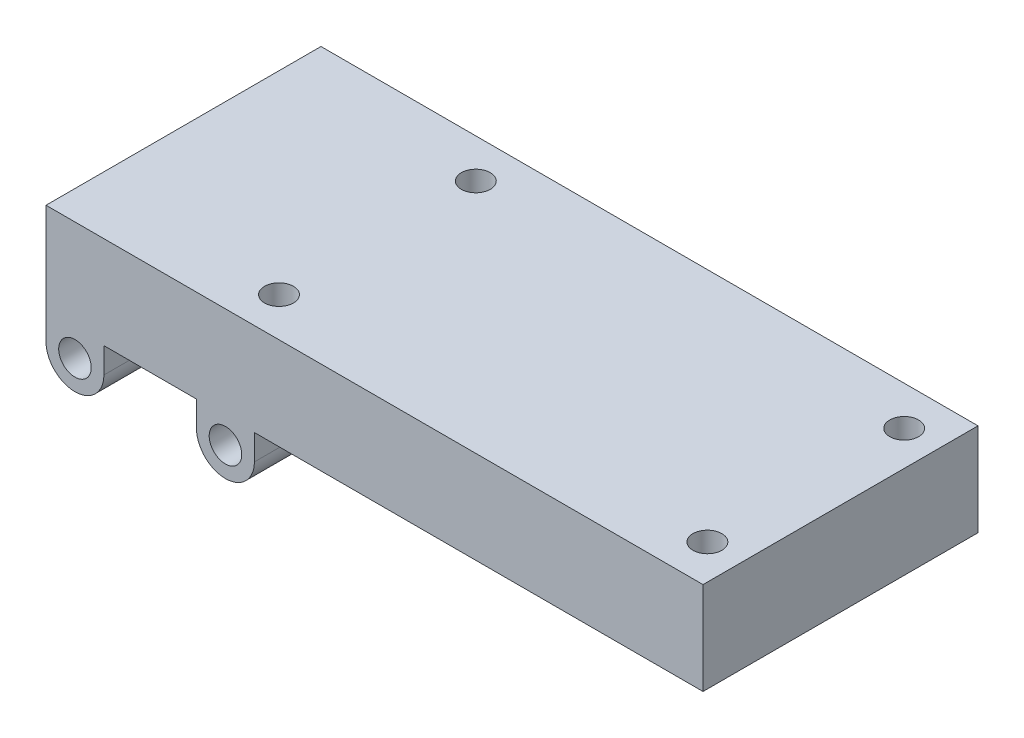
ISO-10303-21;
HEADER;
FILE_DESCRIPTION(('STEP AP214'),'2;1');
FILE_NAME('part.step','',(''),(''),'','','');
FILE_SCHEMA(('AUTOMOTIVE_DESIGN { 1 0 10303 214 1 1 1 1 }'));
ENDSEC;
DATA;
#1=APPLICATION_CONTEXT('core data for automotive mechanical design processes');
#2=APPLICATION_PROTOCOL_DEFINITION('international standard','automotive_design',2000,#1);
#3=PRODUCT_CONTEXT('',#1,'mechanical');
#4=PRODUCT('Part','Part','',(#3));
#5=PRODUCT_RELATED_PRODUCT_CATEGORY('part','',(#4));
#6=PRODUCT_DEFINITION_FORMATION('','',#4);
#7=PRODUCT_DEFINITION_CONTEXT('part definition',#1,'design');
#8=PRODUCT_DEFINITION('design','',#6,#7);
#9=PRODUCT_DEFINITION_SHAPE('','',#8);
#10=(LENGTH_UNIT() NAMED_UNIT(*) SI_UNIT(.MILLI.,.METRE.));
#11=(NAMED_UNIT(*) PLANE_ANGLE_UNIT() SI_UNIT($,.RADIAN.));
#12=(NAMED_UNIT(*) SI_UNIT($,.STERADIAN.) SOLID_ANGLE_UNIT());
#13=UNCERTAINTY_MEASURE_WITH_UNIT(LENGTH_MEASURE(1.E-05),#10,'distance_accuracy_value','');
#14=(GEOMETRIC_REPRESENTATION_CONTEXT(3) GLOBAL_UNCERTAINTY_ASSIGNED_CONTEXT((#13)) GLOBAL_UNIT_ASSIGNED_CONTEXT((#10,
#11,#12)) REPRESENTATION_CONTEXT('',''));
#15=CARTESIAN_POINT('',(0.,0.,0.));
#16=DIRECTION('',(0.,0.,1.));
#17=DIRECTION('',(1.,0.,0.));
#18=AXIS2_PLACEMENT_3D('',#15,#16,#17);
#19=CARTESIAN_POINT('',(0.,11.1125,0.));
#20=DIRECTION('',(0.,1.,0.));
#21=DIRECTION('',(-1.,0.,0.));
#22=AXIS2_PLACEMENT_3D('',#19,#20,#21);
#23=PLANE('',#22);
#24=CARTESIAN_POINT('',(-16.66875,11.1125,-9.52500000000001));
#25=DIRECTION('',(0.,1.,0.));
#26=DIRECTION('',(0.,0.,1.));
#27=AXIS2_PLACEMENT_3D('',#24,#25,#26);
#28=CIRCLE('',#27,1.5875);
#29=CARTESIAN_POINT('',(-16.66875,11.1125,-7.9375));
#30=VERTEX_POINT('',#29);
#31=EDGE_CURVE('E264',#30,#30,#28,.F.);
#32=ORIENTED_EDGE('',*,*,#31,.F.);
#33=EDGE_LOOP('',(#32));
#34=FACE_BOUND('',#33,.T.);
#35=CARTESIAN_POINT('',(-16.66875,11.1125,9.52499999999999));
#36=DIRECTION('',(0.,1.,0.));
#37=DIRECTION('',(0.,0.,1.));
#38=AXIS2_PLACEMENT_3D('',#35,#36,#37);
#39=CIRCLE('',#38,1.5875);
#40=CARTESIAN_POINT('',(-16.66875,11.1125,11.1125));
#41=VERTEX_POINT('',#40);
#42=EDGE_CURVE('E225',#41,#41,#39,.F.);
#43=ORIENTED_EDGE('',*,*,#42,.F.);
#44=EDGE_LOOP('',(#43));
#45=FACE_BOUND('',#44,.T.);
#46=CARTESIAN_POINT('',(16.66875,11.1125,-9.52500000000001));
#47=DIRECTION('',(0.,1.,0.));
#48=DIRECTION('',(0.,0.,1.));
#49=AXIS2_PLACEMENT_3D('',#46,#47,#48);
#50=CIRCLE('',#49,1.5875);
#51=CARTESIAN_POINT('',(16.66875,11.1125,-7.93750000000001));
#52=VERTEX_POINT('',#51);
#53=EDGE_CURVE('E261',#52,#52,#50,.F.);
#54=ORIENTED_EDGE('',*,*,#53,.F.);
#55=EDGE_LOOP('',(#54));
#56=FACE_BOUND('',#55,.T.);
#57=CARTESIAN_POINT('',(16.66875,11.1125,9.52499999999999));
#58=DIRECTION('',(0.,1.,0.));
#59=DIRECTION('',(0.,0.,1.));
#60=AXIS2_PLACEMENT_3D('',#57,#58,#59);
#61=CIRCLE('',#60,1.5875);
#62=CARTESIAN_POINT('',(16.66875,11.1125,11.1125));
#63=VERTEX_POINT('',#62);
#64=EDGE_CURVE('E258',#63,#63,#61,.F.);
#65=ORIENTED_EDGE('',*,*,#64,.F.);
#66=EDGE_LOOP('',(#65));
#67=FACE_BOUND('',#66,.T.);
#68=DIRECTION('',(1.,0.,0.));
#69=VECTOR('',#68,1.);
#70=CARTESIAN_POINT('',(-28.575,11.1125,-2.38125));
#71=LINE('',#70,#69);
#72=CARTESIAN_POINT('',(-28.575,11.1125,-2.38125));
#73=VERTEX_POINT('',#72);
#74=CARTESIAN_POINT('',(-22.225,11.1125,-2.38125));
#75=VERTEX_POINT('',#74);
#76=EDGE_CURVE('E139',#73,#75,#71,.T.);
#77=ORIENTED_EDGE('',*,*,#76,.F.);
#78=DIRECTION('',(0.,0.,1.));
#79=VECTOR('',#78,1.);
#80=CARTESIAN_POINT('',(-28.575,11.1125,-42.457115598187));
#81=LINE('',#80,#79);
#82=CARTESIAN_POINT('',(-28.575,11.1125,15.08125));
#83=VERTEX_POINT('',#82);
#84=EDGE_CURVE('E124',#73,#83,#81,.T.);
#85=ORIENTED_EDGE('',*,*,#84,.T.);
#86=DIRECTION('',(-1.,0.,0.));
#87=VECTOR('',#86,1.);
#88=CARTESIAN_POINT('',(0.,11.1125,15.08125));
#89=LINE('',#88,#87);
#90=CARTESIAN_POINT('',(-38.735,11.1125,15.08125));
#91=VERTEX_POINT('',#90);
#92=EDGE_CURVE('E234',#83,#91,#89,.T.);
#93=ORIENTED_EDGE('',*,*,#92,.T.);
#94=DIRECTION('',(0.,0.,1.));
#95=VECTOR('',#94,1.);
#96=CARTESIAN_POINT('',(-38.735,11.1125,-42.457115598187));
#97=LINE('',#96,#95);
#98=CARTESIAN_POINT('',(-38.735,11.1125,-2.38125));
#99=VERTEX_POINT('',#98);
#100=EDGE_CURVE('E57',#99,#91,#97,.T.);
#101=ORIENTED_EDGE('',*,*,#100,.F.);
#102=DIRECTION('',(1.,0.,0.));
#103=VECTOR('',#102,1.);
#104=CARTESIAN_POINT('',(-45.085,11.1125,-2.38125));
#105=LINE('',#104,#103);
#106=CARTESIAN_POINT('',(-45.085,11.1125,-2.38125));
#107=VERTEX_POINT('',#106);
#108=EDGE_CURVE('E62',#107,#99,#105,.T.);
#109=ORIENTED_EDGE('',*,*,#108,.F.);
#110=DIRECTION('',(0.,0.,1.));
#111=VECTOR('',#110,1.);
#112=CARTESIAN_POINT('',(-45.085,11.1125,-42.457115598187));
#113=LINE('',#112,#111);
#114=CARTESIAN_POINT('',(-45.085,11.1125,-15.08125));
#115=VERTEX_POINT('',#114);
#116=EDGE_CURVE('E11',#115,#107,#113,.T.);
#117=ORIENTED_EDGE('',*,*,#116,.F.);
#118=DIRECTION('',(1.,0.,0.));
#119=VECTOR('',#118,1.);
#120=CARTESIAN_POINT('',(0.,11.1125,-15.08125));
#121=LINE('',#120,#119);
#122=CARTESIAN_POINT('',(26.9875,11.1125,-15.08125));
#123=VERTEX_POINT('',#122);
#124=EDGE_CURVE('E220',#115,#123,#121,.T.);
#125=ORIENTED_EDGE('',*,*,#124,.T.);
#126=DIRECTION('',(0.,0.,1.));
#127=VECTOR('',#126,1.);
#128=CARTESIAN_POINT('',(26.9875,11.1125,0.));
#129=LINE('',#128,#127);
#130=CARTESIAN_POINT('',(26.9875,11.1125,15.08125));
#131=VERTEX_POINT('',#130);
#132=EDGE_CURVE('E171',#123,#131,#129,.T.);
#133=ORIENTED_EDGE('',*,*,#132,.T.);
#134=DIRECTION('',(1.,0.,0.));
#135=VECTOR('',#134,1.);
#136=CARTESIAN_POINT('',(12.3825,11.1125,15.08125));
#137=LINE('',#136,#135);
#138=CARTESIAN_POINT('',(-22.225,11.1125,15.08125));
#139=VERTEX_POINT('',#138);
#140=EDGE_CURVE('E50',#139,#131,#137,.T.);
#141=ORIENTED_EDGE('',*,*,#140,.F.);
#142=DIRECTION('',(0.,0.,1.));
#143=VECTOR('',#142,1.);
#144=CARTESIAN_POINT('',(-22.225,11.1125,-42.457115598187));
#145=LINE('',#144,#143);
#146=EDGE_CURVE('E145',#75,#139,#145,.T.);
#147=ORIENTED_EDGE('',*,*,#146,.F.);
#148=EDGE_LOOP('',(#77,#85,#93,#101,#109,#117,#125,#133,#141,#147));
#149=FACE_BOUND('',#148,.T.);
#150=ADVANCED_FACE('F42',(#34,#45,#56,#67,#149),#23,.F.);
#151=CARTESIAN_POINT('',(-41.91,8.3185,-42.457115598187));
#152=DIRECTION('',(0.,0.,1.));
#153=DIRECTION('',(1.,0.,0.));
#154=AXIS2_PLACEMENT_3D('',#151,#152,#153);
#155=CYLINDRICAL_SURFACE('',#154,1.78593749999999);
#156=CARTESIAN_POINT('',(-41.91,8.3185,15.08125));
#157=DIRECTION('',(0.,0.,1.));
#158=DIRECTION('',(1.,0.,0.));
#159=AXIS2_PLACEMENT_3D('',#156,#157,#158);
#160=CIRCLE('',#159,1.78593749999999);
#161=CARTESIAN_POINT('',(-40.1240625,8.3185,15.08125));
#162=VERTEX_POINT('',#161);
#163=EDGE_CURVE('E243',#162,#162,#160,.T.);
#164=CARTESIAN_POINT('',(-41.91,8.3185,0.793750000000003));
#165=DIRECTION('',(0.,0.,-1.));
#166=DIRECTION('',(-1.,0.,0.));
#167=AXIS2_PLACEMENT_3D('',#164,#165,#166);
#168=CIRCLE('',#167,1.78593749999999);
#169=CARTESIAN_POINT('',(-40.1240625,8.3185,0.793750000000003));
#170=VERTEX_POINT('',#169);
#171=EDGE_CURVE('E162',#170,#170,#168,.F.);
#172=CARTESIAN_POINT('',(-40.1240625,8.3185,15.08125));
#173=CARTESIAN_POINT('',(-40.1240625,8.3185,14.932421875));
#174=CARTESIAN_POINT('',(-40.1240625,8.3185,14.78359375));
#175=CARTESIAN_POINT('',(-40.1240625,8.3185,14.4859375));
#176=CARTESIAN_POINT('',(-40.1240625,8.3185,14.337109375));
#177=CARTESIAN_POINT('',(-40.1240625,8.3185,14.039453125));
#178=CARTESIAN_POINT('',(-40.1240625,8.3185,13.890625));
#179=CARTESIAN_POINT('',(-40.1240625,8.3185,13.59296875));
#180=CARTESIAN_POINT('',(-40.1240625,8.3185,13.444140625));
#181=CARTESIAN_POINT('',(-40.1240625,8.3185,13.146484375));
#182=CARTESIAN_POINT('',(-40.1240625,8.3185,12.99765625));
#183=CARTESIAN_POINT('',(-40.1240625,8.3185,12.7));
#184=CARTESIAN_POINT('',(-40.1240625,8.3185,12.551171875));
#185=CARTESIAN_POINT('',(-40.1240625,8.3185,12.253515625));
#186=CARTESIAN_POINT('',(-40.1240625,8.3185,12.1046875));
#187=CARTESIAN_POINT('',(-40.1240625,8.3185,11.80703125));
#188=CARTESIAN_POINT('',(-40.1240625,8.3185,11.658203125));
#189=CARTESIAN_POINT('',(-40.1240625,8.3185,11.360546875));
#190=CARTESIAN_POINT('',(-40.1240625,8.3185,11.21171875));
#191=CARTESIAN_POINT('',(-40.1240625,8.3185,10.9140625));
#192=CARTESIAN_POINT('',(-40.1240625,8.3185,10.765234375));
#193=CARTESIAN_POINT('',(-40.1240625,8.3185,10.467578125));
#194=CARTESIAN_POINT('',(-40.1240625,8.3185,10.31875));
#195=CARTESIAN_POINT('',(-40.1240625,8.3185,10.02109375));
#196=CARTESIAN_POINT('',(-40.1240625,8.3185,9.872265625));
#197=CARTESIAN_POINT('',(-40.1240625,8.3185,9.574609375));
#198=CARTESIAN_POINT('',(-40.1240625,8.3185,9.42578125));
#199=CARTESIAN_POINT('',(-40.1240625,8.3185,9.128125));
#200=CARTESIAN_POINT('',(-40.1240625,8.3185,8.979296875));
#201=CARTESIAN_POINT('',(-40.1240625,8.3185,8.681640625));
#202=CARTESIAN_POINT('',(-40.1240625,8.3185,8.5328125));
#203=CARTESIAN_POINT('',(-40.1240625,8.3185,8.23515625));
#204=CARTESIAN_POINT('',(-40.1240625,8.3185,8.086328125));
#205=CARTESIAN_POINT('',(-40.1240625,8.3185,7.788671875));
#206=CARTESIAN_POINT('',(-40.1240625,8.3185,7.63984375));
#207=CARTESIAN_POINT('',(-40.1240625,8.3185,7.3421875));
#208=CARTESIAN_POINT('',(-40.1240625,8.3185,7.193359375));
#209=CARTESIAN_POINT('',(-40.1240625,8.3185,6.895703125));
#210=CARTESIAN_POINT('',(-40.1240625,8.3185,6.746875));
#211=CARTESIAN_POINT('',(-40.1240625,8.3185,6.44921875));
#212=CARTESIAN_POINT('',(-40.1240625,8.3185,6.300390625));
#213=CARTESIAN_POINT('',(-40.1240625,8.3185,6.002734375));
#214=CARTESIAN_POINT('',(-40.1240625,8.3185,5.85390625));
#215=CARTESIAN_POINT('',(-40.1240625,8.3185,5.55625));
#216=CARTESIAN_POINT('',(-40.1240625,8.3185,5.407421875));
#217=CARTESIAN_POINT('',(-40.1240625,8.3185,5.109765625));
#218=CARTESIAN_POINT('',(-40.1240625,8.3185,4.96093750000001));
#219=CARTESIAN_POINT('',(-40.1240625,8.3185,4.66328125000001));
#220=CARTESIAN_POINT('',(-40.1240625,8.3185,4.514453125));
#221=CARTESIAN_POINT('',(-40.1240625,8.3185,4.216796875));
#222=CARTESIAN_POINT('',(-40.1240625,8.3185,4.06796875));
#223=CARTESIAN_POINT('',(-40.1240625,8.3185,3.7703125));
#224=CARTESIAN_POINT('',(-40.1240625,8.3185,3.621484375));
#225=CARTESIAN_POINT('',(-40.1240625,8.3185,3.323828125));
#226=CARTESIAN_POINT('',(-40.1240625,8.3185,3.175));
#227=CARTESIAN_POINT('',(-40.1240625,8.3185,2.87734375));
#228=CARTESIAN_POINT('',(-40.1240625,8.3185,2.728515625));
#229=CARTESIAN_POINT('',(-40.1240625,8.3185,2.430859375));
#230=CARTESIAN_POINT('',(-40.1240625,8.3185,2.28203125));
#231=CARTESIAN_POINT('',(-40.1240625,8.3185,1.984375));
#232=CARTESIAN_POINT('',(-40.1240625,8.3185,1.835546875));
#233=CARTESIAN_POINT('',(-40.1240625,8.3185,1.537890625));
#234=CARTESIAN_POINT('',(-40.1240625,8.3185,1.3890625));
#235=CARTESIAN_POINT('',(-40.1240625,8.3185,1.09140625));
#236=CARTESIAN_POINT('',(-40.1240625,8.3185,0.942578125000003));
#237=CARTESIAN_POINT('',(-40.1240625,8.3185,0.793750000000003));
#238=B_SPLINE_CURVE_WITH_KNOTS('',3,(#172,#173,#174,#175,#176,#177,#178,#179,#180,#181,#182,
#183,#184,#185,#186,#187,#188,#189,#190,#191,#192,#193,#194,#195,#196,#197,#198,#199,#200,#201,
#202,#203,#204,#205,#206,#207,#208,#209,#210,#211,#212,#213,#214,#215,#216,#217,#218,#219,#220,
#221,#222,#223,#224,#225,#226,#227,#228,#229,#230,#231,#232,#233,#234,#235,#236,#237),
.UNSPECIFIED.,.F.,.F.,(4,2,2,2,2,2,2,2,2,2,2,2,2,2,2,2,2,2,2,2,2,2,2,2,2,2,2,2,2,2,2,2,4),(0.,
0.446484375,0.892968750000001,1.339453125,1.7859375,2.232421875,2.67890625,3.125390625,3.571875,
4.018359375,4.46484375,4.911328125,5.3578125,5.804296875,6.25078125,6.697265625,7.14375,
7.590234375,8.03671875,8.483203125,8.9296875,9.376171875,9.82265624999999,10.269140625,
10.715625,11.162109375,11.60859375,12.055078125,12.5015625,12.948046875,13.39453125,
13.841015625,14.2875),.UNSPECIFIED.);
#239=EDGE_CURVE('BSEAM292',#162,#170,#238,.T.);
#240=ORIENTED_EDGE('',*,*,#163,.T.);
#241=ORIENTED_EDGE('',*,*,#171,.F.);
#242=ORIENTED_EDGE('',*,*,#239,.T.);
#243=ORIENTED_EDGE('',*,*,#239,.F.);
#244=EDGE_LOOP('',(#240,#242,#241,#243));
#245=FACE_BOUND('',#244,.T.);
#246=ADVANCED_FACE('F292',(#245),#155,.F.);
#247=CARTESIAN_POINT('',(-41.91,8.3185,-42.457115598187));
#248=DIRECTION('',(0.,0.,1.));
#249=DIRECTION('',(1.,0.,0.));
#250=AXIS2_PLACEMENT_3D('',#247,#248,#249);
#251=CYLINDRICAL_SURFACE('',#250,3.175);
#252=DIRECTION('',(0.,0.,1.));
#253=VECTOR('',#252,1.);
#254=CARTESIAN_POINT('',(-45.085,8.3185,-42.457115598187));
#255=LINE('',#254,#253);
#256=CARTESIAN_POINT('',(-45.085,8.3185,-2.38125));
#257=VERTEX_POINT('',#256);
#258=CARTESIAN_POINT('',(-45.085,8.3185,15.08125));
#259=VERTEX_POINT('',#258);
#260=EDGE_CURVE('E249',#257,#259,#255,.T.);
#261=ORIENTED_EDGE('',*,*,#260,.F.);
#262=CARTESIAN_POINT('',(-41.91,8.3185,-2.38125));
#263=DIRECTION('',(0.,0.,-1.));
#264=DIRECTION('',(-1.,0.,0.));
#265=AXIS2_PLACEMENT_3D('',#262,#263,#264);
#266=CIRCLE('',#265,3.175);
#267=CARTESIAN_POINT('',(-38.735,8.31850000000001,-2.38125));
#268=VERTEX_POINT('',#267);
#269=EDGE_CURVE('E155',#268,#257,#266,.T.);
#270=ORIENTED_EDGE('',*,*,#269,.F.);
#271=DIRECTION('',(0.,0.,1.));
#272=VECTOR('',#271,1.);
#273=CARTESIAN_POINT('',(-38.735,8.31850000000001,-42.457115598187));
#274=LINE('',#273,#272);
#275=CARTESIAN_POINT('',(-38.735,8.31850000000001,15.08125));
#276=VERTEX_POINT('',#275);
#277=EDGE_CURVE('E255',#268,#276,#274,.T.);
#278=ORIENTED_EDGE('',*,*,#277,.T.);
#279=CARTESIAN_POINT('',(-41.91,8.3185,15.08125));
#280=DIRECTION('',(0.,0.,1.));
#281=DIRECTION('',(1.,0.,0.));
#282=AXIS2_PLACEMENT_3D('',#279,#280,#281);
#283=CIRCLE('',#282,3.175);
#284=EDGE_CURVE('E228',#259,#276,#283,.T.);
#285=ORIENTED_EDGE('',*,*,#284,.F.);
#286=EDGE_LOOP('',(#261,#270,#278,#285));
#287=FACE_BOUND('',#286,.T.);
#288=ADVANCED_FACE('F298',(#287),#251,.T.);
#289=CARTESIAN_POINT('',(-38.735,0.,-42.457115598187));
#290=DIRECTION('',(-1.,0.,0.));
#291=DIRECTION('',(0.,0.,1.));
#292=AXIS2_PLACEMENT_3D('',#289,#290,#291);
#293=PLANE('',#292);
#294=ORIENTED_EDGE('',*,*,#277,.F.);
#295=DIRECTION('',(0.,-1.,0.));
#296=VECTOR('',#295,1.);
#297=CARTESIAN_POINT('',(-38.735,11.1125,-2.38125));
#298=LINE('',#297,#296);
#299=EDGE_CURVE('E152',#99,#268,#298,.T.);
#300=ORIENTED_EDGE('',*,*,#299,.F.);
#301=ORIENTED_EDGE('',*,*,#100,.T.);
#302=DIRECTION('',(0.,-1.,0.));
#303=VECTOR('',#302,1.);
#304=CARTESIAN_POINT('',(-38.735,0.,15.08125));
#305=LINE('',#304,#303);
#306=EDGE_CURVE('E231',#91,#276,#305,.T.);
#307=ORIENTED_EDGE('',*,*,#306,.T.);
#308=EDGE_LOOP('',(#294,#300,#301,#307));
#309=FACE_BOUND('',#308,.T.);
#310=ADVANCED_FACE('F398',(#309),#293,.F.);
#311=CARTESIAN_POINT('',(-28.575,0.,-42.457115598187));
#312=DIRECTION('',(-1.,0.,0.));
#313=DIRECTION('',(0.,-1.,0.));
#314=AXIS2_PLACEMENT_3D('',#311,#312,#313);
#315=PLANE('',#314);
#316=ORIENTED_EDGE('',*,*,#84,.F.);
#317=DIRECTION('',(0.,1.,0.));
#318=VECTOR('',#317,1.);
#319=CARTESIAN_POINT('',(-28.575,8.3185,-2.38125));
#320=LINE('',#319,#318);
#321=CARTESIAN_POINT('',(-28.575,8.3185,-2.38125));
#322=VERTEX_POINT('',#321);
#323=EDGE_CURVE('E127',#322,#73,#320,.T.);
#324=ORIENTED_EDGE('',*,*,#323,.F.);
#325=DIRECTION('',(0.,0.,1.));
#326=VECTOR('',#325,1.);
#327=CARTESIAN_POINT('',(-28.575,8.3185,-42.457115598187));
#328=LINE('',#327,#326);
#329=CARTESIAN_POINT('',(-28.575,8.3185,15.08125));
#330=VERTEX_POINT('',#329);
#331=EDGE_CURVE('E132',#322,#330,#328,.T.);
#332=ORIENTED_EDGE('',*,*,#331,.T.);
#333=DIRECTION('',(0.,-1.,0.));
#334=VECTOR('',#333,1.);
#335=CARTESIAN_POINT('',(-28.575,0.,15.08125));
#336=LINE('',#335,#334);
#337=EDGE_CURVE('E129',#83,#330,#336,.T.);
#338=ORIENTED_EDGE('',*,*,#337,.F.);
#339=EDGE_LOOP('',(#316,#324,#332,#338));
#340=FACE_BOUND('',#339,.T.);
#341=ADVANCED_FACE('F126',(#340),#315,.T.);
#342=CARTESIAN_POINT('',(-25.4,8.3185,-42.457115598187));
#343=DIRECTION('',(0.,0.,1.));
#344=DIRECTION('',(1.,0.,0.));
#345=AXIS2_PLACEMENT_3D('',#342,#343,#344);
#346=CYLINDRICAL_SURFACE('',#345,3.175);
#347=ORIENTED_EDGE('',*,*,#331,.F.);
#348=CARTESIAN_POINT('',(-25.4,8.3185,-2.38125));
#349=DIRECTION('',(0.,0.,-1.));
#350=DIRECTION('',(-1.,0.,0.));
#351=AXIS2_PLACEMENT_3D('',#348,#349,#350);
#352=CIRCLE('',#351,3.175);
#353=CARTESIAN_POINT('',(-22.225,8.3185,-2.38125));
#354=VERTEX_POINT('',#353);
#355=EDGE_CURVE('E142',#354,#322,#352,.T.);
#356=ORIENTED_EDGE('',*,*,#355,.F.);
#357=DIRECTION('',(0.,0.,1.));
#358=VECTOR('',#357,1.);
#359=CARTESIAN_POINT('',(-22.225,8.3185,-42.457115598187));
#360=LINE('',#359,#358);
#361=CARTESIAN_POINT('',(-22.225,8.3185,15.08125));
#362=VERTEX_POINT('',#361);
#363=EDGE_CURVE('E251',#354,#362,#360,.T.);
#364=ORIENTED_EDGE('',*,*,#363,.T.);
#365=CARTESIAN_POINT('',(-25.4,8.3185,15.08125));
#366=DIRECTION('',(0.,0.,1.));
#367=DIRECTION('',(1.,0.,0.));
#368=AXIS2_PLACEMENT_3D('',#365,#366,#367);
#369=CIRCLE('',#368,3.175);
#370=EDGE_CURVE('E237',#330,#362,#369,.T.);
#371=ORIENTED_EDGE('',*,*,#370,.F.);
#372=EDGE_LOOP('',(#347,#356,#364,#371));
#373=FACE_BOUND('',#372,.T.);
#374=ADVANCED_FACE('F286',(#373),#346,.T.);
#375=CARTESIAN_POINT('',(-22.225,0.,-42.457115598187));
#376=DIRECTION('',(-1.,0.,0.));
#377=DIRECTION('',(0.,0.,1.));
#378=AXIS2_PLACEMENT_3D('',#375,#376,#377);
#379=PLANE('',#378);
#380=ORIENTED_EDGE('',*,*,#363,.F.);
#381=DIRECTION('',(0.,-1.,0.));
#382=VECTOR('',#381,1.);
#383=CARTESIAN_POINT('',(-22.225,11.1125,-2.38125));
#384=LINE('',#383,#382);
#385=EDGE_CURVE('E146',#75,#354,#384,.T.);
#386=ORIENTED_EDGE('',*,*,#385,.F.);
#387=ORIENTED_EDGE('',*,*,#146,.T.);
#388=DIRECTION('',(0.,-1.,0.));
#389=VECTOR('',#388,1.);
#390=CARTESIAN_POINT('',(-22.225,0.,15.08125));
#391=LINE('',#390,#389);
#392=EDGE_CURVE('E240',#139,#362,#391,.T.);
#393=ORIENTED_EDGE('',*,*,#392,.T.);
#394=EDGE_LOOP('',(#380,#386,#387,#393));
#395=FACE_BOUND('',#394,.T.);
#396=ADVANCED_FACE('F278',(#395),#379,.F.);
#397=CARTESIAN_POINT('',(-25.4,8.31850000000001,-42.457115598187));
#398=DIRECTION('',(0.,0.,1.));
#399=DIRECTION('',(1.,0.,0.));
#400=AXIS2_PLACEMENT_3D('',#397,#398,#399);
#401=CYLINDRICAL_SURFACE('',#400,1.78593749999999);
#402=CARTESIAN_POINT('',(-25.4,8.31850000000001,15.08125));
#403=DIRECTION('',(0.,0.,1.));
#404=DIRECTION('',(1.,0.,0.));
#405=AXIS2_PLACEMENT_3D('',#402,#403,#404);
#406=CIRCLE('',#405,1.78593749999999);
#407=CARTESIAN_POINT('',(-23.6140625,8.31850000000001,15.08125));
#408=VERTEX_POINT('',#407);
#409=EDGE_CURVE('E246',#408,#408,#406,.T.);
#410=CARTESIAN_POINT('',(-25.4,8.31850000000001,0.793750000000003));
#411=DIRECTION('',(0.,0.,-1.));
#412=DIRECTION('',(-1.,0.,0.));
#413=AXIS2_PLACEMENT_3D('',#410,#411,#412);
#414=CIRCLE('',#413,1.78593749999999);
#415=CARTESIAN_POINT('',(-23.6140625,8.31850000000001,0.793750000000003));
#416=VERTEX_POINT('',#415);
#417=EDGE_CURVE('E161',#416,#416,#414,.F.);
#418=CARTESIAN_POINT('',(-23.6140625,8.31850000000001,15.08125));
#419=CARTESIAN_POINT('',(-23.6140625,8.31850000000001,14.932421875));
#420=CARTESIAN_POINT('',(-23.6140625,8.31850000000001,14.78359375));
#421=CARTESIAN_POINT('',(-23.6140625,8.31850000000001,14.4859375));
#422=CARTESIAN_POINT('',(-23.6140625,8.31850000000001,14.337109375));
#423=CARTESIAN_POINT('',(-23.6140625,8.31850000000001,14.039453125));
#424=CARTESIAN_POINT('',(-23.6140625,8.31850000000001,13.890625));
#425=CARTESIAN_POINT('',(-23.6140625,8.31850000000001,13.59296875));
#426=CARTESIAN_POINT('',(-23.6140625,8.31850000000001,13.444140625));
#427=CARTESIAN_POINT('',(-23.6140625,8.31850000000001,13.146484375));
#428=CARTESIAN_POINT('',(-23.6140625,8.31850000000001,12.99765625));
#429=CARTESIAN_POINT('',(-23.6140625,8.31850000000001,12.7));
#430=CARTESIAN_POINT('',(-23.6140625,8.31850000000001,12.551171875));
#431=CARTESIAN_POINT('',(-23.6140625,8.31850000000001,12.253515625));
#432=CARTESIAN_POINT('',(-23.6140625,8.31850000000001,12.1046875));
#433=CARTESIAN_POINT('',(-23.6140625,8.31850000000001,11.80703125));
#434=CARTESIAN_POINT('',(-23.6140625,8.31850000000001,11.658203125));
#435=CARTESIAN_POINT('',(-23.6140625,8.31850000000001,11.360546875));
#436=CARTESIAN_POINT('',(-23.6140625,8.31850000000001,11.21171875));
#437=CARTESIAN_POINT('',(-23.6140625,8.31850000000001,10.9140625));
#438=CARTESIAN_POINT('',(-23.6140625,8.31850000000001,10.765234375));
#439=CARTESIAN_POINT('',(-23.6140625,8.31850000000001,10.467578125));
#440=CARTESIAN_POINT('',(-23.6140625,8.31850000000001,10.31875));
#441=CARTESIAN_POINT('',(-23.6140625,8.31850000000001,10.02109375));
#442=CARTESIAN_POINT('',(-23.6140625,8.31850000000001,9.872265625));
#443=CARTESIAN_POINT('',(-23.6140625,8.31850000000001,9.574609375));
#444=CARTESIAN_POINT('',(-23.6140625,8.31850000000001,9.42578125));
#445=CARTESIAN_POINT('',(-23.6140625,8.31850000000001,9.128125));
#446=CARTESIAN_POINT('',(-23.6140625,8.31850000000001,8.979296875));
#447=CARTESIAN_POINT('',(-23.6140625,8.31850000000001,8.681640625));
#448=CARTESIAN_POINT('',(-23.6140625,8.31850000000001,8.5328125));
#449=CARTESIAN_POINT('',(-23.6140625,8.31850000000001,8.23515625));
#450=CARTESIAN_POINT('',(-23.6140625,8.31850000000001,8.086328125));
#451=CARTESIAN_POINT('',(-23.6140625,8.31850000000001,7.788671875));
#452=CARTESIAN_POINT('',(-23.6140625,8.31850000000001,7.63984375));
#453=CARTESIAN_POINT('',(-23.6140625,8.31850000000001,7.3421875));
#454=CARTESIAN_POINT('',(-23.6140625,8.31850000000001,7.193359375));
#455=CARTESIAN_POINT('',(-23.6140625,8.31850000000001,6.895703125));
#456=CARTESIAN_POINT('',(-23.6140625,8.31850000000001,6.746875));
#457=CARTESIAN_POINT('',(-23.6140625,8.31850000000001,6.44921875));
#458=CARTESIAN_POINT('',(-23.6140625,8.31850000000001,6.300390625));
#459=CARTESIAN_POINT('',(-23.6140625,8.31850000000001,6.002734375));
#460=CARTESIAN_POINT('',(-23.6140625,8.31850000000001,5.85390625));
#461=CARTESIAN_POINT('',(-23.6140625,8.31850000000001,5.55625));
#462=CARTESIAN_POINT('',(-23.6140625,8.31850000000001,5.407421875));
#463=CARTESIAN_POINT('',(-23.6140625,8.31850000000001,5.109765625));
#464=CARTESIAN_POINT('',(-23.6140625,8.31850000000001,4.96093750000001));
#465=CARTESIAN_POINT('',(-23.6140625,8.31850000000001,4.66328125000001));
#466=CARTESIAN_POINT('',(-23.6140625,8.31850000000001,4.514453125));
#467=CARTESIAN_POINT('',(-23.6140625,8.31850000000001,4.216796875));
#468=CARTESIAN_POINT('',(-23.6140625,8.31850000000001,4.06796875));
#469=CARTESIAN_POINT('',(-23.6140625,8.31850000000001,3.7703125));
#470=CARTESIAN_POINT('',(-23.6140625,8.31850000000001,3.621484375));
#471=CARTESIAN_POINT('',(-23.6140625,8.31850000000001,3.323828125));
#472=CARTESIAN_POINT('',(-23.6140625,8.31850000000001,3.175));
#473=CARTESIAN_POINT('',(-23.6140625,8.31850000000001,2.87734375));
#474=CARTESIAN_POINT('',(-23.6140625,8.31850000000001,2.728515625));
#475=CARTESIAN_POINT('',(-23.6140625,8.31850000000001,2.430859375));
#476=CARTESIAN_POINT('',(-23.6140625,8.31850000000001,2.28203125));
#477=CARTESIAN_POINT('',(-23.6140625,8.31850000000001,1.984375));
#478=CARTESIAN_POINT('',(-23.6140625,8.31850000000001,1.835546875));
#479=CARTESIAN_POINT('',(-23.6140625,8.31850000000001,1.537890625));
#480=CARTESIAN_POINT('',(-23.6140625,8.31850000000001,1.3890625));
#481=CARTESIAN_POINT('',(-23.6140625,8.31850000000001,1.09140625));
#482=CARTESIAN_POINT('',(-23.6140625,8.31850000000001,0.942578125000003));
#483=CARTESIAN_POINT('',(-23.6140625,8.31850000000001,0.793750000000003));
#484=B_SPLINE_CURVE_WITH_KNOTS('',3,(#418,#419,#420,#421,#422,#423,#424,#425,#426,#427,#428,
#429,#430,#431,#432,#433,#434,#435,#436,#437,#438,#439,#440,#441,#442,#443,#444,#445,#446,#447,
#448,#449,#450,#451,#452,#453,#454,#455,#456,#457,#458,#459,#460,#461,#462,#463,#464,#465,#466,
#467,#468,#469,#470,#471,#472,#473,#474,#475,#476,#477,#478,#479,#480,#481,#482,#483),
.UNSPECIFIED.,.F.,.F.,(4,2,2,2,2,2,2,2,2,2,2,2,2,2,2,2,2,2,2,2,2,2,2,2,2,2,2,2,2,2,2,2,4),(0.,
0.446484375,0.892968750000001,1.339453125,1.7859375,2.232421875,2.67890625,3.125390625,3.571875,
4.018359375,4.46484375,4.911328125,5.3578125,5.804296875,6.25078125,6.697265625,7.14375,
7.590234375,8.03671875,8.483203125,8.9296875,9.376171875,9.82265624999999,10.269140625,
10.715625,11.162109375,11.60859375,12.055078125,12.5015625,12.948046875,13.39453125,
13.841015625,14.2875),.UNSPECIFIED.);
#485=EDGE_CURVE('BSEAM275',#408,#416,#484,.T.);
#486=ORIENTED_EDGE('',*,*,#409,.T.);
#487=ORIENTED_EDGE('',*,*,#417,.F.);
#488=ORIENTED_EDGE('',*,*,#485,.T.);
#489=ORIENTED_EDGE('',*,*,#485,.F.);
#490=EDGE_LOOP('',(#486,#488,#487,#489));
#491=FACE_BOUND('',#490,.T.);
#492=ADVANCED_FACE('F275',(#491),#401,.F.);
#493=CARTESIAN_POINT('',(0.,0.,15.08125));
#494=DIRECTION('',(0.,0.,1.));
#495=DIRECTION('',(1.,0.,0.));
#496=AXIS2_PLACEMENT_3D('',#493,#494,#495);
#497=PLANE('',#496);
#498=DIRECTION('',(0.,1.,0.));
#499=VECTOR('',#498,1.);
#500=CARTESIAN_POINT('',(26.9875,5.14349999999999,15.08125));
#501=LINE('',#500,#499);
#502=CARTESIAN_POINT('',(26.9875,21.2725,15.08125));
#503=VERTEX_POINT('',#502);
#504=EDGE_CURVE('E168',#131,#503,#501,.T.);
#505=ORIENTED_EDGE('',*,*,#504,.T.);
#506=DIRECTION('',(-1.,0.,0.));
#507=VECTOR('',#506,1.);
#508=CARTESIAN_POINT('',(20.6375,21.2725,15.08125));
#509=LINE('',#508,#507);
#510=CARTESIAN_POINT('',(-45.085,21.2725,15.08125));
#511=VERTEX_POINT('',#510);
#512=EDGE_CURVE('E217',#503,#511,#509,.T.);
#513=ORIENTED_EDGE('',*,*,#512,.T.);
#514=DIRECTION('',(0.,1.,0.));
#515=VECTOR('',#514,1.);
#516=CARTESIAN_POINT('',(-45.085,0.,15.08125));
#517=LINE('',#516,#515);
#518=EDGE_CURVE('E219',#259,#511,#517,.T.);
#519=ORIENTED_EDGE('',*,*,#518,.F.);
#520=ORIENTED_EDGE('',*,*,#284,.T.);
#521=ORIENTED_EDGE('',*,*,#306,.F.);
#522=ORIENTED_EDGE('',*,*,#92,.F.);
#523=ORIENTED_EDGE('',*,*,#337,.T.);
#524=ORIENTED_EDGE('',*,*,#370,.T.);
#525=ORIENTED_EDGE('',*,*,#392,.F.);
#526=ORIENTED_EDGE('',*,*,#140,.T.);
#527=EDGE_LOOP('',(#505,#513,#519,#520,#521,#522,#523,#524,#525,#526));
#528=FACE_BOUND('',#527,.T.);
#529=ORIENTED_EDGE('',*,*,#163,.F.);
#530=EDGE_LOOP('',(#529));
#531=FACE_BOUND('',#530,.T.);
#532=ORIENTED_EDGE('',*,*,#409,.F.);
#533=EDGE_LOOP('',(#532));
#534=FACE_BOUND('',#533,.T.);
#535=ADVANCED_FACE('F277',(#528,#531,#534),#497,.T.);
#536=CARTESIAN_POINT('',(0.,0.,-15.08125));
#537=DIRECTION('',(0.,0.,1.));
#538=DIRECTION('',(1.,0.,0.));
#539=AXIS2_PLACEMENT_3D('',#536,#537,#538);
#540=PLANE('',#539);
#541=DIRECTION('',(0.,1.,0.));
#542=VECTOR('',#541,1.);
#543=CARTESIAN_POINT('',(26.9875,5.14349999999999,-15.08125));
#544=LINE('',#543,#542);
#545=CARTESIAN_POINT('',(26.9875,21.2725,-15.08125));
#546=VERTEX_POINT('',#545);
#547=EDGE_CURVE('E167',#123,#546,#544,.T.);
#548=ORIENTED_EDGE('',*,*,#547,.F.);
#549=ORIENTED_EDGE('',*,*,#124,.F.);
#550=DIRECTION('',(0.,-1.,0.));
#551=VECTOR('',#550,1.);
#552=CARTESIAN_POINT('',(-45.085,0.,-15.08125));
#553=LINE('',#552,#551);
#554=CARTESIAN_POINT('',(-45.085,21.2725,-15.08125));
#555=VERTEX_POINT('',#554);
#556=EDGE_CURVE('E222',#555,#115,#553,.T.);
#557=ORIENTED_EDGE('',*,*,#556,.F.);
#558=DIRECTION('',(1.,0.,0.));
#559=VECTOR('',#558,1.);
#560=CARTESIAN_POINT('',(20.6375,21.2725,-15.08125));
#561=LINE('',#560,#559);
#562=EDGE_CURVE('E206',#555,#546,#561,.T.);
#563=ORIENTED_EDGE('',*,*,#562,.T.);
#564=EDGE_LOOP('',(#548,#549,#557,#563));
#565=FACE_BOUND('',#564,.T.);
#566=ADVANCED_FACE('F44',(#565),#540,.F.);
#567=CARTESIAN_POINT('',(-16.66875,1.85987193946543,-9.52500000000001));
#568=DIRECTION('',(0.,1.,0.));
#569=DIRECTION('',(0.,0.,1.));
#570=AXIS2_PLACEMENT_3D('',#567,#568,#569);
#571=CYLINDRICAL_SURFACE('',#570,1.5875);
#572=ORIENTED_EDGE('',*,*,#31,.T.);
#573=EDGE_LOOP('',(#572));
#574=FACE_BOUND('',#573,.T.);
#575=CARTESIAN_POINT('',(-16.66875,17.4625,-9.52500000000001));
#576=DIRECTION('',(0.,1.,0.));
#577=DIRECTION('',(-1.,0.,0.));
#578=AXIS2_PLACEMENT_3D('',#575,#576,#577);
#579=CIRCLE('',#578,1.5875);
#580=CARTESIAN_POINT('',(-18.25625,17.4625,-9.52500000000001));
#581=VERTEX_POINT('',#580);
#582=EDGE_CURVE('E199',#581,#581,#579,.F.);
#583=ORIENTED_EDGE('',*,*,#582,.F.);
#584=EDGE_LOOP('',(#583));
#585=FACE_BOUND('',#584,.T.);
#586=ADVANCED_FACE('F317',(#574,#585),#571,.F.);
#587=CARTESIAN_POINT('',(16.66875,1.85987193946543,-9.52500000000001));
#588=DIRECTION('',(0.,1.,0.));
#589=DIRECTION('',(0.,0.,1.));
#590=AXIS2_PLACEMENT_3D('',#587,#588,#589);
#591=CYLINDRICAL_SURFACE('',#590,1.5875);
#592=ORIENTED_EDGE('',*,*,#53,.T.);
#593=EDGE_LOOP('',(#592));
#594=FACE_BOUND('',#593,.T.);
#595=CARTESIAN_POINT('',(16.66875,17.4625,-9.52500000000001));
#596=DIRECTION('',(0.,1.,0.));
#597=DIRECTION('',(-1.,0.,0.));
#598=AXIS2_PLACEMENT_3D('',#595,#596,#597);
#599=CIRCLE('',#598,1.5875);
#600=CARTESIAN_POINT('',(15.08125,17.4625,-9.52500000000001));
#601=VERTEX_POINT('',#600);
#602=EDGE_CURVE('E196',#601,#601,#599,.F.);
#603=ORIENTED_EDGE('',*,*,#602,.F.);
#604=EDGE_LOOP('',(#603));
#605=FACE_BOUND('',#604,.T.);
#606=ADVANCED_FACE('F313',(#594,#605),#591,.F.);
#607=CARTESIAN_POINT('',(16.66875,1.85987193946543,9.52499999999999));
#608=DIRECTION('',(0.,1.,0.));
#609=DIRECTION('',(0.,0.,1.));
#610=AXIS2_PLACEMENT_3D('',#607,#608,#609);
#611=CYLINDRICAL_SURFACE('',#610,1.5875);
#612=ORIENTED_EDGE('',*,*,#64,.T.);
#613=EDGE_LOOP('',(#612));
#614=FACE_BOUND('',#613,.T.);
#615=CARTESIAN_POINT('',(16.66875,17.4625,9.52499999999999));
#616=DIRECTION('',(0.,1.,0.));
#617=DIRECTION('',(-1.,0.,0.));
#618=AXIS2_PLACEMENT_3D('',#615,#616,#617);
#619=CIRCLE('',#618,1.5875);
#620=CARTESIAN_POINT('',(15.08125,17.4625,9.52499999999999));
#621=VERTEX_POINT('',#620);
#622=EDGE_CURVE('E193',#621,#621,#619,.F.);
#623=ORIENTED_EDGE('',*,*,#622,.F.);
#624=EDGE_LOOP('',(#623));
#625=FACE_BOUND('',#624,.T.);
#626=ADVANCED_FACE('F309',(#614,#625),#611,.F.);
#627=CARTESIAN_POINT('',(-16.66875,1.85987193946543,9.52499999999999));
#628=DIRECTION('',(0.,1.,0.));
#629=DIRECTION('',(0.,0.,1.));
#630=AXIS2_PLACEMENT_3D('',#627,#628,#629);
#631=CYLINDRICAL_SURFACE('',#630,1.5875);
#632=ORIENTED_EDGE('',*,*,#42,.T.);
#633=EDGE_LOOP('',(#632));
#634=FACE_BOUND('',#633,.T.);
#635=CARTESIAN_POINT('',(-16.66875,17.4625,9.52499999999999));
#636=DIRECTION('',(0.,1.,0.));
#637=DIRECTION('',(-1.,0.,0.));
#638=AXIS2_PLACEMENT_3D('',#635,#636,#637);
#639=CIRCLE('',#638,1.5875);
#640=CARTESIAN_POINT('',(-18.25625,17.4625,9.52499999999999));
#641=VERTEX_POINT('',#640);
#642=EDGE_CURVE('E190',#641,#641,#639,.F.);
#643=ORIENTED_EDGE('',*,*,#642,.F.);
#644=EDGE_LOOP('',(#643));
#645=FACE_BOUND('',#644,.T.);
#646=ADVANCED_FACE('F306',(#634,#645),#631,.F.);
#647=CARTESIAN_POINT('',(-45.085,0.,-42.457115598187));
#648=DIRECTION('',(1.,0.,0.));
#649=DIRECTION('',(0.,0.,-1.));
#650=AXIS2_PLACEMENT_3D('',#647,#648,#649);
#651=PLANE('',#650);
#652=ORIENTED_EDGE('',*,*,#556,.T.);
#653=ORIENTED_EDGE('',*,*,#116,.T.);
#654=DIRECTION('',(0.,1.,0.));
#655=VECTOR('',#654,1.);
#656=CARTESIAN_POINT('',(-45.085,8.3185,-2.38125));
#657=LINE('',#656,#655);
#658=EDGE_CURVE('E158',#257,#107,#657,.T.);
#659=ORIENTED_EDGE('',*,*,#658,.F.);
#660=ORIENTED_EDGE('',*,*,#260,.T.);
#661=ORIENTED_EDGE('',*,*,#518,.T.);
#662=DIRECTION('',(0.,0.,1.));
#663=VECTOR('',#662,1.);
#664=CARTESIAN_POINT('',(-45.085,21.2725,15.08125));
#665=LINE('',#664,#663);
#666=EDGE_CURVE('E179',#555,#511,#665,.T.);
#667=ORIENTED_EDGE('',*,*,#666,.F.);
#668=EDGE_LOOP('',(#652,#653,#659,#660,#661,#667));
#669=FACE_BOUND('',#668,.T.);
#670=ADVANCED_FACE('F304',(#669),#651,.F.);
#671=CARTESIAN_POINT('',(0.,21.2725,0.));
#672=DIRECTION('',(0.,-1.,0.));
#673=DIRECTION('',(1.,0.,0.));
#674=AXIS2_PLACEMENT_3D('',#671,#672,#673);
#675=PLANE('',#674);
#676=CARTESIAN_POINT('',(-23.8125,21.2725,-10.795));
#677=DIRECTION('',(0.,1.,0.));
#678=DIRECTION('',(-1.,0.,0.));
#679=AXIS2_PLACEMENT_3D('',#676,#677,#678);
#680=CIRCLE('',#679,1.5875);
#681=CARTESIAN_POINT('',(-25.4,21.2725,-10.795));
#682=VERTEX_POINT('',#681);
#683=EDGE_CURVE('E175',#682,#682,#680,.T.);
#684=ORIENTED_EDGE('',*,*,#683,.F.);
#685=EDGE_LOOP('',(#684));
#686=FACE_BOUND('',#685,.T.);
#687=CARTESIAN_POINT('',(-23.8125,21.2725,10.795));
#688=DIRECTION('',(0.,1.,0.));
#689=DIRECTION('',(-1.,0.,0.));
#690=AXIS2_PLACEMENT_3D('',#687,#688,#689);
#691=CIRCLE('',#690,1.5875);
#692=CARTESIAN_POINT('',(-25.4,21.2725,10.795));
#693=VERTEX_POINT('',#692);
#694=EDGE_CURVE('E180',#693,#693,#691,.T.);
#695=ORIENTED_EDGE('',*,*,#694,.F.);
#696=EDGE_LOOP('',(#695));
#697=FACE_BOUND('',#696,.T.);
#698=CARTESIAN_POINT('',(23.1775,21.2725,10.795));
#699=DIRECTION('',(0.,1.,0.));
#700=DIRECTION('',(-1.,0.,0.));
#701=AXIS2_PLACEMENT_3D('',#698,#699,#700);
#702=CIRCLE('',#701,1.5875);
#703=CARTESIAN_POINT('',(21.59,21.2725,10.795));
#704=VERTEX_POINT('',#703);
#705=EDGE_CURVE('E207',#704,#704,#702,.T.);
#706=ORIENTED_EDGE('',*,*,#705,.F.);
#707=EDGE_LOOP('',(#706));
#708=FACE_BOUND('',#707,.T.);
#709=CARTESIAN_POINT('',(23.1775,21.2725,-10.795));
#710=DIRECTION('',(0.,1.,0.));
#711=DIRECTION('',(-1.,0.,0.));
#712=AXIS2_PLACEMENT_3D('',#709,#710,#711);
#713=CIRCLE('',#712,1.5875);
#714=CARTESIAN_POINT('',(21.59,21.2725,-10.795));
#715=VERTEX_POINT('',#714);
#716=EDGE_CURVE('E202',#715,#715,#713,.T.);
#717=ORIENTED_EDGE('',*,*,#716,.F.);
#718=EDGE_LOOP('',(#717));
#719=FACE_BOUND('',#718,.T.);
#720=ORIENTED_EDGE('',*,*,#512,.F.);
#721=DIRECTION('',(0.,0.,1.));
#722=VECTOR('',#721,1.);
#723=CARTESIAN_POINT('',(26.9875,21.2725,15.08125));
#724=LINE('',#723,#722);
#725=EDGE_CURVE('E165',#546,#503,#724,.T.);
#726=ORIENTED_EDGE('',*,*,#725,.F.);
#727=ORIENTED_EDGE('',*,*,#562,.F.);
#728=ORIENTED_EDGE('',*,*,#666,.T.);
#729=EDGE_LOOP('',(#720,#726,#727,#728));
#730=FACE_BOUND('',#729,.T.);
#731=ADVANCED_FACE('F369',(#686,#697,#708,#719,#730),#675,.F.);
#732=CARTESIAN_POINT('',(23.1775,14.9225,-10.795));
#733=DIRECTION('',(0.,1.,0.));
#734=DIRECTION('',(-1.,0.,0.));
#735=AXIS2_PLACEMENT_3D('',#732,#733,#734);
#736=CYLINDRICAL_SURFACE('',#735,1.5875);
#737=CARTESIAN_POINT('',(23.1775,14.9225,-10.795));
#738=DIRECTION('',(0.,1.,0.));
#739=DIRECTION('',(-1.,0.,0.));
#740=AXIS2_PLACEMENT_3D('',#737,#738,#739);
#741=CIRCLE('',#740,1.5875);
#742=CARTESIAN_POINT('',(21.59,14.9225,-10.795));
#743=VERTEX_POINT('',#742);
#744=EDGE_CURVE('E210',#743,#743,#741,.T.);
#745=ORIENTED_EDGE('',*,*,#744,.F.);
#746=EDGE_LOOP('',(#745));
#747=FACE_BOUND('',#746,.T.);
#748=ORIENTED_EDGE('',*,*,#716,.T.);
#749=EDGE_LOOP('',(#748));
#750=FACE_BOUND('',#749,.T.);
#751=ADVANCED_FACE('F366',(#747,#750),#736,.F.);
#752=CARTESIAN_POINT('',(23.1775,14.9225,-10.795));
#753=DIRECTION('',(0.,1.,0.));
#754=DIRECTION('',(-1.,0.,0.));
#755=AXIS2_PLACEMENT_3D('',#752,#753,#754);
#756=PLANE('',#755);
#757=ORIENTED_EDGE('',*,*,#744,.T.);
#758=EDGE_LOOP('',(#757));
#759=FACE_BOUND('',#758,.T.);
#760=ADVANCED_FACE('F360',(#759),#756,.T.);
#761=CARTESIAN_POINT('',(23.1775,14.9225,10.795));
#762=DIRECTION('',(0.,1.,0.));
#763=DIRECTION('',(-1.,0.,0.));
#764=AXIS2_PLACEMENT_3D('',#761,#762,#763);
#765=CYLINDRICAL_SURFACE('',#764,1.5875);
#766=CARTESIAN_POINT('',(23.1775,14.9225,10.795));
#767=DIRECTION('',(0.,1.,0.));
#768=DIRECTION('',(-1.,0.,0.));
#769=AXIS2_PLACEMENT_3D('',#766,#767,#768);
#770=CIRCLE('',#769,1.5875);
#771=CARTESIAN_POINT('',(21.59,14.9225,10.795));
#772=VERTEX_POINT('',#771);
#773=EDGE_CURVE('E203',#772,#772,#770,.T.);
#774=ORIENTED_EDGE('',*,*,#773,.F.);
#775=EDGE_LOOP('',(#774));
#776=FACE_BOUND('',#775,.T.);
#777=ORIENTED_EDGE('',*,*,#705,.T.);
#778=EDGE_LOOP('',(#777));
#779=FACE_BOUND('',#778,.T.);
#780=ADVANCED_FACE('F353',(#776,#779),#765,.F.);
#781=CARTESIAN_POINT('',(23.1775,14.9225,10.795));
#782=DIRECTION('',(0.,1.,0.));
#783=DIRECTION('',(-1.,0.,0.));
#784=AXIS2_PLACEMENT_3D('',#781,#782,#783);
#785=PLANE('',#784);
#786=ORIENTED_EDGE('',*,*,#773,.T.);
#787=EDGE_LOOP('',(#786));
#788=FACE_BOUND('',#787,.T.);
#789=ADVANCED_FACE('F346',(#788),#785,.T.);
#790=CARTESIAN_POINT('',(-75.4871793009974,17.4625,-15.08125));
#791=DIRECTION('',(0.,1.,0.));
#792=DIRECTION('',(-1.,0.,0.));
#793=AXIS2_PLACEMENT_3D('',#790,#791,#792);
#794=PLANE('',#793);
#795=ORIENTED_EDGE('',*,*,#642,.T.);
#796=EDGE_LOOP('',(#795));
#797=FACE_BOUND('',#796,.T.);
#798=ADVANCED_FACE('F333',(#797),#794,.F.);
#799=ORIENTED_EDGE('',*,*,#622,.T.);
#800=EDGE_LOOP('',(#799));
#801=FACE_BOUND('',#800,.T.);
#802=ADVANCED_FACE('F341',(#801),#794,.F.);
#803=ORIENTED_EDGE('',*,*,#602,.T.);
#804=EDGE_LOOP('',(#803));
#805=FACE_BOUND('',#804,.T.);
#806=ADVANCED_FACE('F331',(#805),#794,.F.);
#807=ORIENTED_EDGE('',*,*,#582,.T.);
#808=EDGE_LOOP('',(#807));
#809=FACE_BOUND('',#808,.T.);
#810=ADVANCED_FACE('F328',(#809),#794,.F.);
#811=CARTESIAN_POINT('',(-23.8125,14.9225,10.795));
#812=DIRECTION('',(0.,1.,0.));
#813=DIRECTION('',(-1.,0.,0.));
#814=AXIS2_PLACEMENT_3D('',#811,#812,#813);
#815=CYLINDRICAL_SURFACE('',#814,1.5875);
#816=CARTESIAN_POINT('',(-23.8125,14.9225,10.795));
#817=DIRECTION('',(0.,1.,0.));
#818=DIRECTION('',(-1.,0.,0.));
#819=AXIS2_PLACEMENT_3D('',#816,#817,#818);
#820=CIRCLE('',#819,1.5875);
#821=CARTESIAN_POINT('',(-25.4,14.9225,10.795));
#822=VERTEX_POINT('',#821);
#823=EDGE_CURVE('E176',#822,#822,#820,.T.);
#824=ORIENTED_EDGE('',*,*,#823,.F.);
#825=EDGE_LOOP('',(#824));
#826=FACE_BOUND('',#825,.T.);
#827=ORIENTED_EDGE('',*,*,#694,.T.);
#828=EDGE_LOOP('',(#827));
#829=FACE_BOUND('',#828,.T.);
#830=ADVANCED_FACE('F330',(#826,#829),#815,.F.);
#831=CARTESIAN_POINT('',(-23.8125,14.9225,10.795));
#832=DIRECTION('',(0.,1.,0.));
#833=DIRECTION('',(-1.,0.,0.));
#834=AXIS2_PLACEMENT_3D('',#831,#832,#833);
#835=PLANE('',#834);
#836=ORIENTED_EDGE('',*,*,#823,.T.);
#837=EDGE_LOOP('',(#836));
#838=FACE_BOUND('',#837,.T.);
#839=ADVANCED_FACE('F338',(#838),#835,.T.);
#840=CARTESIAN_POINT('',(-23.8125,14.9225,-10.795));
#841=DIRECTION('',(0.,1.,0.));
#842=DIRECTION('',(-1.,0.,0.));
#843=AXIS2_PLACEMENT_3D('',#840,#841,#842);
#844=CYLINDRICAL_SURFACE('',#843,1.5875);
#845=CARTESIAN_POINT('',(-23.8125,14.9225,-10.795));
#846=DIRECTION('',(0.,1.,0.));
#847=DIRECTION('',(-1.,0.,0.));
#848=AXIS2_PLACEMENT_3D('',#845,#846,#847);
#849=CIRCLE('',#848,1.5875);
#850=CARTESIAN_POINT('',(-25.4,14.9225,-10.795));
#851=VERTEX_POINT('',#850);
#852=EDGE_CURVE('E183',#851,#851,#849,.T.);
#853=ORIENTED_EDGE('',*,*,#852,.F.);
#854=EDGE_LOOP('',(#853));
#855=FACE_BOUND('',#854,.T.);
#856=ORIENTED_EDGE('',*,*,#683,.T.);
#857=EDGE_LOOP('',(#856));
#858=FACE_BOUND('',#857,.T.);
#859=ADVANCED_FACE('F416',(#855,#858),#844,.F.);
#860=CARTESIAN_POINT('',(-23.8125,14.9225,-10.795));
#861=DIRECTION('',(0.,1.,0.));
#862=DIRECTION('',(-1.,0.,0.));
#863=AXIS2_PLACEMENT_3D('',#860,#861,#862);
#864=PLANE('',#863);
#865=ORIENTED_EDGE('',*,*,#852,.T.);
#866=EDGE_LOOP('',(#865));
#867=FACE_BOUND('',#866,.T.);
#868=ADVANCED_FACE('F408',(#867),#864,.T.);
#869=CARTESIAN_POINT('',(26.9875,5.14349999999999,15.08125));
#870=DIRECTION('',(-1.,0.,0.));
#871=DIRECTION('',(0.,-1.,0.));
#872=AXIS2_PLACEMENT_3D('',#869,#870,#871);
#873=PLANE('',#872);
#874=ORIENTED_EDGE('',*,*,#547,.T.);
#875=ORIENTED_EDGE('',*,*,#725,.T.);
#876=ORIENTED_EDGE('',*,*,#504,.F.);
#877=ORIENTED_EDGE('',*,*,#132,.F.);
#878=EDGE_LOOP('',(#874,#875,#876,#877));
#879=FACE_BOUND('',#878,.T.);
#880=ADVANCED_FACE('F406',(#879),#873,.F.);
#881=CARTESIAN_POINT('',(-41.91,8.3185,-2.38125));
#882=DIRECTION('',(0.,0.,-1.));
#883=DIRECTION('',(-1.,0.,0.));
#884=AXIS2_PLACEMENT_3D('',#881,#882,#883);
#885=PLANE('',#884);
#886=ORIENTED_EDGE('',*,*,#108,.T.);
#887=ORIENTED_EDGE('',*,*,#299,.T.);
#888=ORIENTED_EDGE('',*,*,#269,.T.);
#889=ORIENTED_EDGE('',*,*,#658,.T.);
#890=EDGE_LOOP('',(#886,#887,#888,#889));
#891=FACE_BOUND('',#890,.T.);
#892=ADVANCED_FACE('F396',(#891),#885,.T.);
#893=CARTESIAN_POINT('',(-41.91,8.3185,0.793750000000001));
#894=DIRECTION('',(0.,0.,-1.));
#895=DIRECTION('',(-1.,0.,0.));
#896=AXIS2_PLACEMENT_3D('',#893,#894,#895);
#897=PLANE('',#896);
#898=ORIENTED_EDGE('',*,*,#171,.T.);
#899=EDGE_LOOP('',(#898));
#900=FACE_BOUND('',#899,.T.);
#901=ADVANCED_FACE('F414',(#900),#897,.F.);
#902=CARTESIAN_POINT('',(-25.4,8.3185,-2.38125));
#903=DIRECTION('',(0.,0.,-1.));
#904=DIRECTION('',(-1.,0.,0.));
#905=AXIS2_PLACEMENT_3D('',#902,#903,#904);
#906=PLANE('',#905);
#907=ORIENTED_EDGE('',*,*,#323,.T.);
#908=ORIENTED_EDGE('',*,*,#76,.T.);
#909=ORIENTED_EDGE('',*,*,#385,.T.);
#910=ORIENTED_EDGE('',*,*,#355,.T.);
#911=EDGE_LOOP('',(#907,#908,#909,#910));
#912=FACE_BOUND('',#911,.T.);
#913=ADVANCED_FACE('F137',(#912),#906,.T.);
#914=CARTESIAN_POINT('',(-25.4,8.3185,0.793750000000001));
#915=DIRECTION('',(0.,0.,-1.));
#916=DIRECTION('',(-1.,0.,0.));
#917=AXIS2_PLACEMENT_3D('',#914,#915,#916);
#918=PLANE('',#917);
#919=ORIENTED_EDGE('',*,*,#417,.T.);
#920=EDGE_LOOP('',(#919));
#921=FACE_BOUND('',#920,.T.);
#922=ADVANCED_FACE('F273',(#921),#918,.F.);
#923=CLOSED_SHELL('',(#150,#246,#288,#310,#341,#374,#396,#492,#535,#566,#586,#606,#626,#646,
#670,#731,#751,#760,#780,#789,#798,#802,#806,#810,#830,#839,#859,#868,#880,#892,#901,#913,#922));
#924=MANIFOLD_SOLID_BREP('B2',#923);
#925=ADVANCED_BREP_SHAPE_REPRESENTATION('',(#18,#924),#14);
#926=SHAPE_DEFINITION_REPRESENTATION(#9,#925);
ENDSEC;
END-ISO-10303-21;
